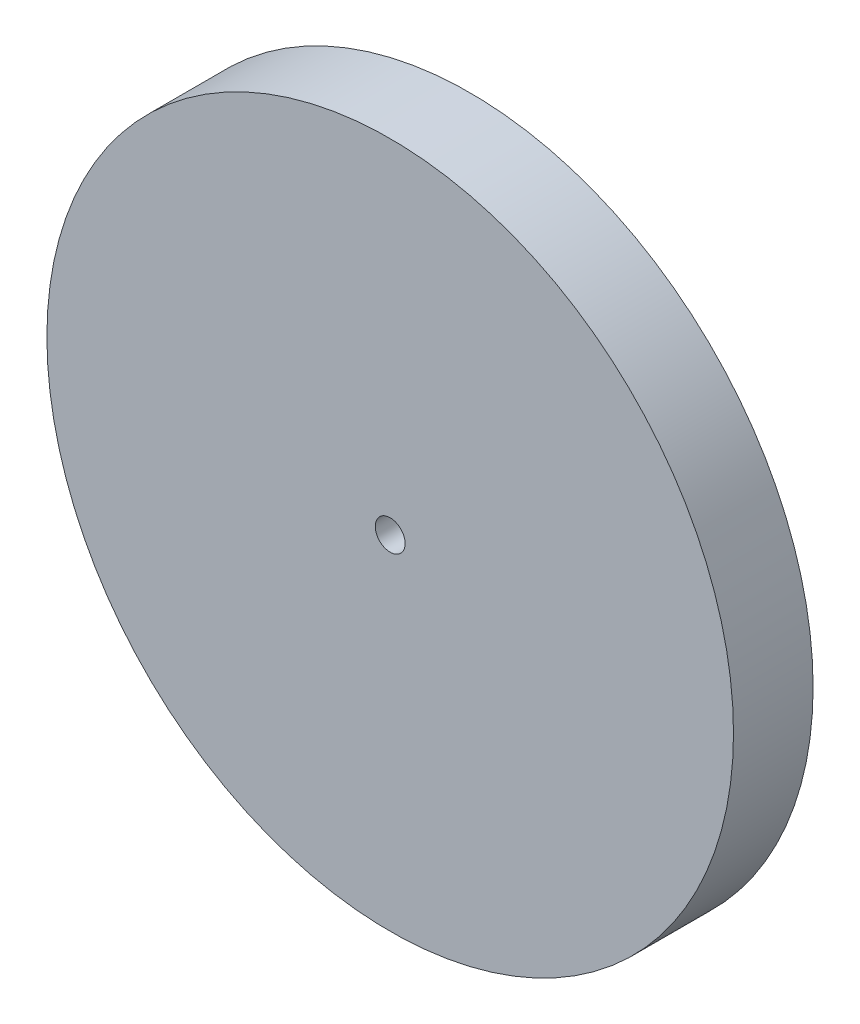
ISO-10303-21;
HEADER;
FILE_DESCRIPTION(('STEP AP214'),'2;1');
FILE_NAME('part.step','',(''),(''),'','','');
FILE_SCHEMA(('AUTOMOTIVE_DESIGN { 1 0 10303 214 1 1 1 1 }'));
ENDSEC;
DATA;
#1=APPLICATION_CONTEXT('core data for automotive mechanical design processes');
#2=APPLICATION_PROTOCOL_DEFINITION('international standard','automotive_design',2000,#1);
#3=PRODUCT_CONTEXT('',#1,'mechanical');
#4=PRODUCT('Part','Part','',(#3));
#5=PRODUCT_RELATED_PRODUCT_CATEGORY('part','',(#4));
#6=PRODUCT_DEFINITION_FORMATION('','',#4);
#7=PRODUCT_DEFINITION_CONTEXT('part definition',#1,'design');
#8=PRODUCT_DEFINITION('design','',#6,#7);
#9=PRODUCT_DEFINITION_SHAPE('','',#8);
#10=(LENGTH_UNIT() NAMED_UNIT(*) SI_UNIT(.MILLI.,.METRE.));
#11=(NAMED_UNIT(*) PLANE_ANGLE_UNIT() SI_UNIT($,.RADIAN.));
#12=(NAMED_UNIT(*) SI_UNIT($,.STERADIAN.) SOLID_ANGLE_UNIT());
#13=UNCERTAINTY_MEASURE_WITH_UNIT(LENGTH_MEASURE(1.E-05),#10,'distance_accuracy_value','');
#14=(GEOMETRIC_REPRESENTATION_CONTEXT(3) GLOBAL_UNCERTAINTY_ASSIGNED_CONTEXT((#13)) GLOBAL_UNIT_ASSIGNED_CONTEXT((#10,
#11,#12)) REPRESENTATION_CONTEXT('',''));
#15=CARTESIAN_POINT('',(0.,0.,0.));
#16=DIRECTION('',(0.,0.,1.));
#17=DIRECTION('',(1.,0.,0.));
#18=AXIS2_PLACEMENT_3D('',#15,#16,#17);
#19=CARTESIAN_POINT('',(0.,0.,8.));
#20=DIRECTION('',(0.,0.,1.));
#21=DIRECTION('',(1.,0.,0.));
#22=AXIS2_PLACEMENT_3D('',#19,#20,#21);
#23=PLANE('',#22);
#24=CARTESIAN_POINT('',(0.,0.,8.));
#25=DIRECTION('',(0.,0.,1.));
#26=DIRECTION('',(1.,0.,0.));
#27=AXIS2_PLACEMENT_3D('',#24,#25,#26);
#28=CIRCLE('',#27,34.5);
#29=CARTESIAN_POINT('',(34.5,0.,8.));
#30=VERTEX_POINT('',#29);
#31=EDGE_CURVE('E10',#30,#30,#28,.T.);
#32=ORIENTED_EDGE('',*,*,#31,.T.);
#33=EDGE_LOOP('',(#32));
#34=FACE_BOUND('',#33,.T.);
#35=CARTESIAN_POINT('',(0.,0.,8.));
#36=DIRECTION('',(0.,0.,1.));
#37=DIRECTION('',(1.,0.,0.));
#38=AXIS2_PLACEMENT_3D('',#35,#36,#37);
#39=CIRCLE('',#38,1.5);
#40=CARTESIAN_POINT('',(1.5,0.,8.));
#41=VERTEX_POINT('',#40);
#42=EDGE_CURVE('E40',#41,#41,#39,.T.);
#43=ORIENTED_EDGE('',*,*,#42,.F.);
#44=EDGE_LOOP('',(#43));
#45=FACE_BOUND('',#44,.T.);
#46=ADVANCED_FACE('F29',(#34,#45),#23,.T.);
#47=CARTESIAN_POINT('',(0.,0.,0.));
#48=DIRECTION('',(0.,0.,1.));
#49=DIRECTION('',(1.,0.,0.));
#50=AXIS2_PLACEMENT_3D('',#47,#48,#49);
#51=PLANE('',#50);
#52=CARTESIAN_POINT('',(0.,0.,0.));
#53=DIRECTION('',(0.,0.,1.));
#54=DIRECTION('',(1.,0.,0.));
#55=AXIS2_PLACEMENT_3D('',#52,#53,#54);
#56=CIRCLE('',#55,34.5);
#57=CARTESIAN_POINT('',(34.5,0.,0.));
#58=VERTEX_POINT('',#57);
#59=EDGE_CURVE('E33',#58,#58,#56,.T.);
#60=ORIENTED_EDGE('',*,*,#59,.F.);
#61=EDGE_LOOP('',(#60));
#62=FACE_BOUND('',#61,.T.);
#63=CARTESIAN_POINT('',(0.,0.,0.));
#64=DIRECTION('',(0.,0.,1.));
#65=DIRECTION('',(1.,0.,0.));
#66=AXIS2_PLACEMENT_3D('',#63,#64,#65);
#67=CIRCLE('',#66,1.5);
#68=CARTESIAN_POINT('',(1.5,0.,0.));
#69=VERTEX_POINT('',#68);
#70=EDGE_CURVE('E42',#69,#69,#67,.T.);
#71=ORIENTED_EDGE('',*,*,#70,.T.);
#72=EDGE_LOOP('',(#71));
#73=FACE_BOUND('',#72,.T.);
#74=ADVANCED_FACE('F52',(#62,#73),#51,.F.);
#75=CARTESIAN_POINT('',(0.,0.,8.));
#76=DIRECTION('',(0.,0.,-1.));
#77=DIRECTION('',(-1.,0.,0.));
#78=AXIS2_PLACEMENT_3D('',#75,#76,#77);
#79=CYLINDRICAL_SURFACE('',#78,34.5);
#80=ORIENTED_EDGE('',*,*,#31,.F.);
#81=EDGE_LOOP('',(#80));
#82=FACE_BOUND('',#81,.T.);
#83=ORIENTED_EDGE('',*,*,#59,.T.);
#84=EDGE_LOOP('',(#83));
#85=FACE_BOUND('',#84,.T.);
#86=ADVANCED_FACE('F31',(#82,#85),#79,.T.);
#87=CARTESIAN_POINT('',(0.,0.,8.));
#88=DIRECTION('',(0.,0.,-1.));
#89=DIRECTION('',(-1.,0.,0.));
#90=AXIS2_PLACEMENT_3D('',#87,#88,#89);
#91=CYLINDRICAL_SURFACE('',#90,1.5);
#92=ORIENTED_EDGE('',*,*,#42,.T.);
#93=EDGE_LOOP('',(#92));
#94=FACE_BOUND('',#93,.T.);
#95=ORIENTED_EDGE('',*,*,#70,.F.);
#96=EDGE_LOOP('',(#95));
#97=FACE_BOUND('',#96,.T.);
#98=ADVANCED_FACE('F48',(#94,#97),#91,.F.);
#99=CLOSED_SHELL('',(#46,#74,#86,#98));
#100=MANIFOLD_SOLID_BREP('B2',#99);
#101=ADVANCED_BREP_SHAPE_REPRESENTATION('',(#18,#100),#14);
#102=SHAPE_DEFINITION_REPRESENTATION(#9,#101);
ENDSEC;
END-ISO-10303-21;
